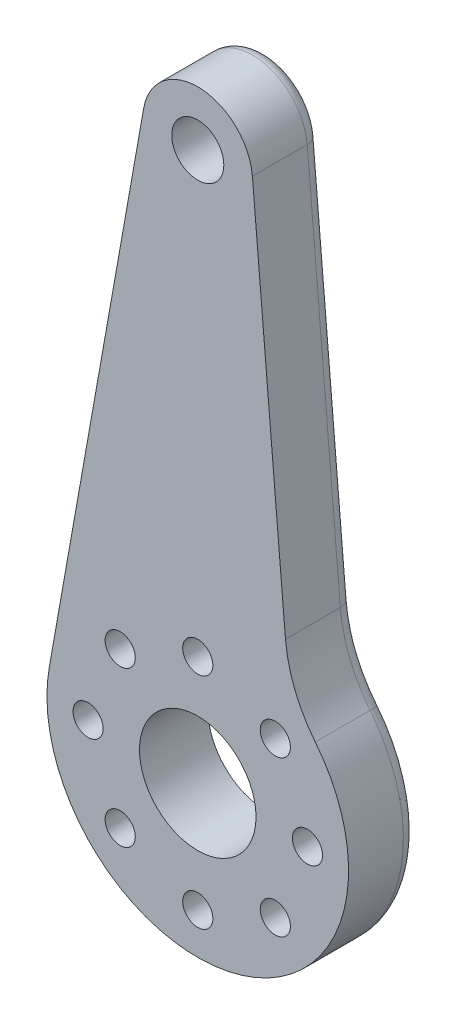
ISO-10303-21;
HEADER;
FILE_DESCRIPTION(('STEP AP214'),'2;1');
FILE_NAME('part.step','',(''),(''),'','','');
FILE_SCHEMA(('AUTOMOTIVE_DESIGN { 1 0 10303 214 1 1 1 1 }'));
ENDSEC;
DATA;
#1=APPLICATION_CONTEXT('core data for automotive mechanical design processes');
#2=APPLICATION_PROTOCOL_DEFINITION('international standard','automotive_design',2000,#1);
#3=PRODUCT_CONTEXT('',#1,'mechanical');
#4=PRODUCT('Part','Part','',(#3));
#5=PRODUCT_RELATED_PRODUCT_CATEGORY('part','',(#4));
#6=PRODUCT_DEFINITION_FORMATION('','',#4);
#7=PRODUCT_DEFINITION_CONTEXT('part definition',#1,'design');
#8=PRODUCT_DEFINITION('design','',#6,#7);
#9=PRODUCT_DEFINITION_SHAPE('','',#8);
#10=(LENGTH_UNIT() NAMED_UNIT(*) SI_UNIT(.MILLI.,.METRE.));
#11=(NAMED_UNIT(*) PLANE_ANGLE_UNIT() SI_UNIT($,.RADIAN.));
#12=(NAMED_UNIT(*) SI_UNIT($,.STERADIAN.) SOLID_ANGLE_UNIT());
#13=UNCERTAINTY_MEASURE_WITH_UNIT(LENGTH_MEASURE(1.E-05),#10,'distance_accuracy_value','');
#14=(GEOMETRIC_REPRESENTATION_CONTEXT(3) GLOBAL_UNCERTAINTY_ASSIGNED_CONTEXT((#13)) GLOBAL_UNIT_ASSIGNED_CONTEXT((#10,
#11,#12)) REPRESENTATION_CONTEXT('',''));
#15=CARTESIAN_POINT('',(0.,0.,0.));
#16=DIRECTION('',(0.,0.,1.));
#17=DIRECTION('',(1.,0.,0.));
#18=AXIS2_PLACEMENT_3D('',#15,#16,#17);
#19=CARTESIAN_POINT('',(-6.98836404370238,-20.3489036018759,5.));
#20=DIRECTION('',(0.,0.,-1.));
#21=DIRECTION('',(-1.,0.,0.));
#22=AXIS2_PLACEMENT_3D('',#19,#20,#21);
#23=CYLINDRICAL_SURFACE('',#22,1.1);
#24=CARTESIAN_POINT('',(-6.98836404370238,-20.3489036018759,5.));
#25=DIRECTION('',(0.,0.,1.));
#26=DIRECTION('',(1.,0.,0.));
#27=AXIS2_PLACEMENT_3D('',#24,#25,#26);
#28=CIRCLE('',#27,1.1);
#29=CARTESIAN_POINT('',(-5.88836404370238,-20.3489036018759,5.));
#30=VERTEX_POINT('',#29);
#31=EDGE_CURVE('E191',#30,#30,#28,.T.);
#32=ORIENTED_EDGE('',*,*,#31,.T.);
#33=EDGE_LOOP('',(#32));
#34=FACE_BOUND('',#33,.T.);
#35=CARTESIAN_POINT('',(-6.98836404370238,-20.3489036018759,2.25));
#36=DIRECTION('',(0.,0.,-1.));
#37=DIRECTION('',(-1.,0.,0.));
#38=AXIS2_PLACEMENT_3D('',#35,#36,#37);
#39=CIRCLE('',#38,1.1);
#40=CARTESIAN_POINT('',(-8.08836404370238,-20.3489036018759,2.25));
#41=VERTEX_POINT('',#40);
#42=EDGE_CURVE('E173',#41,#41,#39,.T.);
#43=ORIENTED_EDGE('',*,*,#42,.T.);
#44=EDGE_LOOP('',(#43));
#45=FACE_BOUND('',#44,.T.);
#46=ADVANCED_FACE('F36',(#34,#45),#23,.F.);
#47=CARTESIAN_POINT('',(-9.33150979421,-26.0057578513683,5.));
#48=DIRECTION('',(0.,0.,-1.));
#49=DIRECTION('',(-1.,0.,0.));
#50=AXIS2_PLACEMENT_3D('',#47,#48,#49);
#51=CYLINDRICAL_SURFACE('',#50,1.1);
#52=CARTESIAN_POINT('',(-9.33150979421,-26.0057578513683,5.));
#53=DIRECTION('',(0.,0.,1.));
#54=DIRECTION('',(1.,0.,0.));
#55=AXIS2_PLACEMENT_3D('',#52,#53,#54);
#56=CIRCLE('',#55,1.1);
#57=CARTESIAN_POINT('',(-8.23150979421,-26.0057578513683,5.));
#58=VERTEX_POINT('',#57);
#59=EDGE_CURVE('E188',#58,#58,#56,.T.);
#60=ORIENTED_EDGE('',*,*,#59,.T.);
#61=EDGE_LOOP('',(#60));
#62=FACE_BOUND('',#61,.T.);
#63=CARTESIAN_POINT('',(-9.33150979421,-26.0057578513683,2.25));
#64=DIRECTION('',(0.,0.,-1.));
#65=DIRECTION('',(-1.,0.,0.));
#66=AXIS2_PLACEMENT_3D('',#63,#64,#65);
#67=CIRCLE('',#66,1.1);
#68=CARTESIAN_POINT('',(-10.43150979421,-26.0057578513683,2.25));
#69=VERTEX_POINT('',#68);
#70=EDGE_CURVE('E230',#69,#69,#67,.T.);
#71=ORIENTED_EDGE('',*,*,#70,.T.);
#72=EDGE_LOOP('',(#71));
#73=FACE_BOUND('',#72,.T.);
#74=ADVANCED_FACE('F308',(#62,#73),#51,.F.);
#75=CARTESIAN_POINT('',(-14.9883640437024,-28.3489036018759,5.));
#76=DIRECTION('',(0.,0.,-1.));
#77=DIRECTION('',(-1.,0.,0.));
#78=AXIS2_PLACEMENT_3D('',#75,#76,#77);
#79=CYLINDRICAL_SURFACE('',#78,1.1);
#80=CARTESIAN_POINT('',(-14.9883640437024,-28.3489036018759,5.));
#81=DIRECTION('',(0.,0.,1.));
#82=DIRECTION('',(1.,0.,0.));
#83=AXIS2_PLACEMENT_3D('',#80,#81,#82);
#84=CIRCLE('',#83,1.1);
#85=CARTESIAN_POINT('',(-13.8883640437024,-28.3489036018759,5.));
#86=VERTEX_POINT('',#85);
#87=EDGE_CURVE('E185',#86,#86,#84,.T.);
#88=ORIENTED_EDGE('',*,*,#87,.T.);
#89=EDGE_LOOP('',(#88));
#90=FACE_BOUND('',#89,.T.);
#91=CARTESIAN_POINT('',(-14.9883640437024,-28.3489036018759,2.25));
#92=DIRECTION('',(0.,0.,-1.));
#93=DIRECTION('',(-1.,0.,0.));
#94=AXIS2_PLACEMENT_3D('',#91,#92,#93);
#95=CIRCLE('',#94,1.1);
#96=CARTESIAN_POINT('',(-16.0883640437024,-28.3489036018759,2.25));
#97=VERTEX_POINT('',#96);
#98=EDGE_CURVE('E227',#97,#97,#95,.T.);
#99=ORIENTED_EDGE('',*,*,#98,.T.);
#100=EDGE_LOOP('',(#99));
#101=FACE_BOUND('',#100,.T.);
#102=ADVANCED_FACE('F314',(#90,#101),#79,.F.);
#103=CARTESIAN_POINT('',(-20.6452182931948,-26.0057578513683,5.));
#104=DIRECTION('',(0.,0.,-1.));
#105=DIRECTION('',(-1.,0.,0.));
#106=AXIS2_PLACEMENT_3D('',#103,#104,#105);
#107=CYLINDRICAL_SURFACE('',#106,1.1);
#108=CARTESIAN_POINT('',(-20.6452182931948,-26.0057578513683,5.));
#109=DIRECTION('',(0.,0.,1.));
#110=DIRECTION('',(1.,0.,0.));
#111=AXIS2_PLACEMENT_3D('',#108,#109,#110);
#112=CIRCLE('',#111,1.1);
#113=CARTESIAN_POINT('',(-19.5452182931948,-26.0057578513683,5.));
#114=VERTEX_POINT('',#113);
#115=EDGE_CURVE('E182',#114,#114,#112,.T.);
#116=ORIENTED_EDGE('',*,*,#115,.T.);
#117=EDGE_LOOP('',(#116));
#118=FACE_BOUND('',#117,.T.);
#119=CARTESIAN_POINT('',(-20.6452182931948,-26.0057578513683,2.25));
#120=DIRECTION('',(0.,0.,-1.));
#121=DIRECTION('',(-1.,0.,0.));
#122=AXIS2_PLACEMENT_3D('',#119,#120,#121);
#123=CIRCLE('',#122,1.1);
#124=CARTESIAN_POINT('',(-21.7452182931948,-26.0057578513683,2.25));
#125=VERTEX_POINT('',#124);
#126=EDGE_CURVE('E224',#125,#125,#123,.T.);
#127=ORIENTED_EDGE('',*,*,#126,.T.);
#128=EDGE_LOOP('',(#127));
#129=FACE_BOUND('',#128,.T.);
#130=ADVANCED_FACE('F425',(#118,#129),#107,.F.);
#131=CARTESIAN_POINT('',(-22.9883640437024,-20.3489036018759,5.));
#132=DIRECTION('',(0.,0.,-1.));
#133=DIRECTION('',(-1.,0.,0.));
#134=AXIS2_PLACEMENT_3D('',#131,#132,#133);
#135=CYLINDRICAL_SURFACE('',#134,1.1);
#136=CARTESIAN_POINT('',(-22.9883640437024,-20.3489036018759,5.));
#137=DIRECTION('',(0.,0.,1.));
#138=DIRECTION('',(1.,0.,0.));
#139=AXIS2_PLACEMENT_3D('',#136,#137,#138);
#140=CIRCLE('',#139,1.1);
#141=CARTESIAN_POINT('',(-21.8883640437024,-20.3489036018759,5.));
#142=VERTEX_POINT('',#141);
#143=EDGE_CURVE('E179',#142,#142,#140,.T.);
#144=ORIENTED_EDGE('',*,*,#143,.T.);
#145=EDGE_LOOP('',(#144));
#146=FACE_BOUND('',#145,.T.);
#147=CARTESIAN_POINT('',(-22.9883640437024,-20.3489036018759,2.25));
#148=DIRECTION('',(0.,0.,-1.));
#149=DIRECTION('',(-1.,0.,0.));
#150=AXIS2_PLACEMENT_3D('',#147,#148,#149);
#151=CIRCLE('',#150,1.1);
#152=CARTESIAN_POINT('',(-24.0883640437024,-20.3489036018759,2.25));
#153=VERTEX_POINT('',#152);
#154=EDGE_CURVE('E221',#153,#153,#151,.T.);
#155=ORIENTED_EDGE('',*,*,#154,.T.);
#156=EDGE_LOOP('',(#155));
#157=FACE_BOUND('',#156,.T.);
#158=ADVANCED_FACE('F421',(#146,#157),#135,.F.);
#159=CARTESIAN_POINT('',(-20.6452182931948,-14.6920493523836,5.));
#160=DIRECTION('',(0.,0.,-1.));
#161=DIRECTION('',(-1.,0.,0.));
#162=AXIS2_PLACEMENT_3D('',#159,#160,#161);
#163=CYLINDRICAL_SURFACE('',#162,1.1);
#164=CARTESIAN_POINT('',(-20.6452182931948,-14.6920493523836,5.));
#165=DIRECTION('',(0.,0.,1.));
#166=DIRECTION('',(1.,0.,0.));
#167=AXIS2_PLACEMENT_3D('',#164,#165,#166);
#168=CIRCLE('',#167,1.1);
#169=CARTESIAN_POINT('',(-19.5452182931948,-14.6920493523836,5.));
#170=VERTEX_POINT('',#169);
#171=EDGE_CURVE('E176',#170,#170,#168,.T.);
#172=ORIENTED_EDGE('',*,*,#171,.T.);
#173=EDGE_LOOP('',(#172));
#174=FACE_BOUND('',#173,.T.);
#175=CARTESIAN_POINT('',(-20.6452182931948,-14.6920493523836,2.25));
#176=DIRECTION('',(0.,0.,-1.));
#177=DIRECTION('',(-1.,0.,0.));
#178=AXIS2_PLACEMENT_3D('',#175,#176,#177);
#179=CIRCLE('',#178,1.1);
#180=CARTESIAN_POINT('',(-21.7452182931948,-14.6920493523836,2.25));
#181=VERTEX_POINT('',#180);
#182=EDGE_CURVE('E218',#181,#181,#179,.T.);
#183=ORIENTED_EDGE('',*,*,#182,.T.);
#184=EDGE_LOOP('',(#183));
#185=FACE_BOUND('',#184,.T.);
#186=ADVANCED_FACE('F417',(#174,#185),#163,.F.);
#187=CARTESIAN_POINT('',(-14.9883640437024,-12.3489036018759,5.));
#188=DIRECTION('',(0.,0.,-1.));
#189=DIRECTION('',(-1.,0.,0.));
#190=AXIS2_PLACEMENT_3D('',#187,#188,#189);
#191=CYLINDRICAL_SURFACE('',#190,1.1);
#192=CARTESIAN_POINT('',(-14.9883640437024,-12.3489036018759,5.));
#193=DIRECTION('',(0.,0.,1.));
#194=DIRECTION('',(1.,0.,0.));
#195=AXIS2_PLACEMENT_3D('',#192,#193,#194);
#196=CIRCLE('',#195,1.1);
#197=CARTESIAN_POINT('',(-13.8883640437024,-12.3489036018759,5.));
#198=VERTEX_POINT('',#197);
#199=EDGE_CURVE('E172',#198,#198,#196,.T.);
#200=ORIENTED_EDGE('',*,*,#199,.T.);
#201=EDGE_LOOP('',(#200));
#202=FACE_BOUND('',#201,.T.);
#203=CARTESIAN_POINT('',(-14.9883640437024,-12.3489036018759,2.25));
#204=DIRECTION('',(0.,0.,-1.));
#205=DIRECTION('',(-1.,0.,0.));
#206=AXIS2_PLACEMENT_3D('',#203,#204,#205);
#207=CIRCLE('',#206,1.1);
#208=CARTESIAN_POINT('',(-16.0883640437024,-12.3489036018759,2.25));
#209=VERTEX_POINT('',#208);
#210=EDGE_CURVE('E215',#209,#209,#207,.T.);
#211=ORIENTED_EDGE('',*,*,#210,.T.);
#212=EDGE_LOOP('',(#211));
#213=FACE_BOUND('',#212,.T.);
#214=ADVANCED_FACE('F413',(#202,#213),#191,.F.);
#215=CARTESIAN_POINT('',(-9.33150979421,-14.6920493523836,5.));
#216=DIRECTION('',(0.,0.,-1.));
#217=DIRECTION('',(-1.,0.,0.));
#218=AXIS2_PLACEMENT_3D('',#215,#216,#217);
#219=CYLINDRICAL_SURFACE('',#218,1.1);
#220=CARTESIAN_POINT('',(-9.33150979421,-14.6920493523836,5.));
#221=DIRECTION('',(0.,0.,1.));
#222=DIRECTION('',(1.,0.,0.));
#223=AXIS2_PLACEMENT_3D('',#220,#221,#222);
#224=CIRCLE('',#223,1.1);
#225=CARTESIAN_POINT('',(-8.23150979421,-14.6920493523836,5.));
#226=VERTEX_POINT('',#225);
#227=EDGE_CURVE('E169',#226,#226,#224,.T.);
#228=ORIENTED_EDGE('',*,*,#227,.T.);
#229=EDGE_LOOP('',(#228));
#230=FACE_BOUND('',#229,.T.);
#231=CARTESIAN_POINT('',(-9.33150979421,-14.6920493523836,2.25));
#232=DIRECTION('',(0.,0.,-1.));
#233=DIRECTION('',(-1.,0.,0.));
#234=AXIS2_PLACEMENT_3D('',#231,#232,#233);
#235=CIRCLE('',#234,1.1);
#236=CARTESIAN_POINT('',(-10.43150979421,-14.6920493523836,2.25));
#237=VERTEX_POINT('',#236);
#238=EDGE_CURVE('E166',#237,#237,#235,.T.);
#239=ORIENTED_EDGE('',*,*,#238,.T.);
#240=EDGE_LOOP('',(#239));
#241=FACE_BOUND('',#240,.T.);
#242=ADVANCED_FACE('F331',(#230,#241),#219,.F.);
#243=CARTESIAN_POINT('',(-14.9883640437024,19.6510963981241,5.));
#244=DIRECTION('',(0.,0.,1.));
#245=DIRECTION('',(1.,0.,0.));
#246=AXIS2_PLACEMENT_3D('',#243,#244,#245);
#247=PLANE('',#246);
#248=DIRECTION('',(0.0857880421638127,-0.996313410439557,0.));
#249=VECTOR('',#248,1.);
#250=CARTESIAN_POINT('',(-11.0031104019442,19.9942485667793,5.));
#251=LINE('',#250,#249);
#252=CARTESIAN_POINT('',(-11.0031104019442,19.9942485667793,5.));
#253=VERTEX_POINT('',#252);
#254=CARTESIAN_POINT('',(-8.58888305649522,-8.04377420949149,5.));
#255=VERTEX_POINT('',#254);
#256=EDGE_CURVE('E110',#253,#255,#251,.T.);
#257=ORIENTED_EDGE('',*,*,#256,.F.);
#258=CARTESIAN_POINT('',(-14.9883640437024,19.6510963981241,5.));
#259=DIRECTION('',(0.,0.,1.));
#260=DIRECTION('',(1.,0.,0.));
#261=AXIS2_PLACEMENT_3D('',#258,#259,#260);
#262=CIRCLE('',#261,4.);
#263=CARTESIAN_POINT('',(-18.9266377772054,20.3510963981241,5.));
#264=VERTEX_POINT('',#263);
#265=EDGE_CURVE('E99',#253,#264,#262,.T.);
#266=ORIENTED_EDGE('',*,*,#265,.T.);
#267=DIRECTION('',(-0.175,-0.984568433375761,0.));
#268=VECTOR('',#267,1.);
#269=CARTESIAN_POINT('',(-18.9266377772054,20.3510963981241,5.));
#270=LINE('',#269,#268);
#271=CARTESIAN_POINT('',(-25.8186168108358,-18.4239036018759,5.));
#272=VERTEX_POINT('',#271);
#273=EDGE_CURVE('E105',#264,#272,#270,.T.);
#274=ORIENTED_EDGE('',*,*,#273,.T.);
#275=CARTESIAN_POINT('',(-14.9883640437024,-20.3489036018759,5.));
#276=DIRECTION('',(0.,0.,1.));
#277=DIRECTION('',(1.,0.,0.));
#278=AXIS2_PLACEMENT_3D('',#275,#276,#277);
#279=CIRCLE('',#278,11.);
#280=CARTESIAN_POINT('',(-6.41747042429143,-13.4539936992927,5.));
#281=VERTEX_POINT('',#280);
#282=EDGE_CURVE('E206',#272,#281,#279,.T.);
#283=ORIENTED_EDGE('',*,*,#282,.T.);
#284=CARTESIAN_POINT('',(1.37425104790034,-7.18589378785335,5.));
#285=DIRECTION('',(0.,0.,1.));
#286=DIRECTION('',(1.,0.,0.));
#287=AXIS2_PLACEMENT_3D('',#284,#285,#286);
#288=CIRCLE('',#287,10.);
#289=EDGE_CURVE('E117',#281,#255,#288,.F.);
#290=ORIENTED_EDGE('',*,*,#289,.T.);
#291=EDGE_LOOP('',(#257,#266,#274,#283,#290));
#292=FACE_BOUND('',#291,.T.);
#293=ORIENTED_EDGE('',*,*,#199,.F.);
#294=EDGE_LOOP('',(#293));
#295=FACE_BOUND('',#294,.T.);
#296=ORIENTED_EDGE('',*,*,#143,.F.);
#297=EDGE_LOOP('',(#296));
#298=FACE_BOUND('',#297,.T.);
#299=ORIENTED_EDGE('',*,*,#87,.F.);
#300=EDGE_LOOP('',(#299));
#301=FACE_BOUND('',#300,.T.);
#302=ORIENTED_EDGE('',*,*,#31,.F.);
#303=EDGE_LOOP('',(#302));
#304=FACE_BOUND('',#303,.T.);
#305=CARTESIAN_POINT('',(-14.9883640437024,19.6510963981241,5.));
#306=DIRECTION('',(0.,0.,1.));
#307=DIRECTION('',(1.,0.,0.));
#308=AXIS2_PLACEMENT_3D('',#305,#306,#307);
#309=CIRCLE('',#308,1.9);
#310=CARTESIAN_POINT('',(-13.0883640437024,19.6510963981241,5.));
#311=VERTEX_POINT('',#310);
#312=EDGE_CURVE('E106',#311,#311,#309,.T.);
#313=ORIENTED_EDGE('',*,*,#312,.F.);
#314=EDGE_LOOP('',(#313));
#315=FACE_BOUND('',#314,.T.);
#316=CARTESIAN_POINT('',(-14.9883640437024,-20.3489036018759,5.));
#317=DIRECTION('',(0.,0.,1.));
#318=DIRECTION('',(1.,0.,0.));
#319=AXIS2_PLACEMENT_3D('',#316,#317,#318);
#320=CIRCLE('',#319,4.25);
#321=CARTESIAN_POINT('',(-10.7383640437024,-20.3489036018759,5.));
#322=VERTEX_POINT('',#321);
#323=EDGE_CURVE('E195',#322,#322,#320,.T.);
#324=ORIENTED_EDGE('',*,*,#323,.F.);
#325=EDGE_LOOP('',(#324));
#326=FACE_BOUND('',#325,.T.);
#327=ORIENTED_EDGE('',*,*,#59,.F.);
#328=EDGE_LOOP('',(#327));
#329=FACE_BOUND('',#328,.T.);
#330=ORIENTED_EDGE('',*,*,#115,.F.);
#331=EDGE_LOOP('',(#330));
#332=FACE_BOUND('',#331,.T.);
#333=ORIENTED_EDGE('',*,*,#171,.F.);
#334=EDGE_LOOP('',(#333));
#335=FACE_BOUND('',#334,.T.);
#336=ORIENTED_EDGE('',*,*,#227,.F.);
#337=EDGE_LOOP('',(#336));
#338=FACE_BOUND('',#337,.T.);
#339=ADVANCED_FACE('F113',(#292,#295,#298,#301,#304,#315,#326,#329,#332,#335,#338),#247,.T.);
#340=CARTESIAN_POINT('',(-14.9883640437024,19.6510963981241,0.));
#341=DIRECTION('',(0.,0.,1.));
#342=DIRECTION('',(1.,0.,0.));
#343=AXIS2_PLACEMENT_3D('',#340,#341,#342);
#344=PLANE('',#343);
#345=CARTESIAN_POINT('',(1.37425104790034,-7.18589378785335,0.));
#346=DIRECTION('',(0.,0.,1.));
#347=DIRECTION('',(1.,0.,0.));
#348=AXIS2_PLACEMENT_3D('',#345,#346,#347);
#349=CIRCLE('',#348,11.);
#350=CARTESIAN_POINT('',(-9.58519646693478,-8.12956225165529,0.));
#351=VERTEX_POINT('',#350);
#352=CARTESIAN_POINT('',(-7.1966425715106,-14.0808036904366,0.));
#353=VERTEX_POINT('',#352);
#354=EDGE_CURVE('E248',#351,#353,#349,.T.);
#355=ORIENTED_EDGE('',*,*,#354,.T.);
#356=CARTESIAN_POINT('',(-14.9883640437024,-20.3489036018759,0.));
#357=DIRECTION('',(0.,0.,1.));
#358=DIRECTION('',(1.,0.,0.));
#359=AXIS2_PLACEMENT_3D('',#356,#357,#358);
#360=CIRCLE('',#359,10.);
#361=CARTESIAN_POINT('',(-24.83404837746,-18.5989036018759,0.));
#362=VERTEX_POINT('',#361);
#363=EDGE_CURVE('E250',#353,#362,#360,.F.);
#364=ORIENTED_EDGE('',*,*,#363,.T.);
#365=DIRECTION('',(-0.175,-0.984568433375761,0.));
#366=VECTOR('',#365,1.);
#367=CARTESIAN_POINT('',(-17.9420693438297,20.1760963981241,0.));
#368=LINE('',#367,#366);
#369=CARTESIAN_POINT('',(-17.9420693438297,20.1760963981241,0.));
#370=VERTEX_POINT('',#369);
#371=EDGE_CURVE('E242',#362,#370,#368,.F.);
#372=ORIENTED_EDGE('',*,*,#371,.T.);
#373=CARTESIAN_POINT('',(-14.9883640437024,19.6510963981241,0.));
#374=DIRECTION('',(0.,0.,1.));
#375=DIRECTION('',(1.,0.,0.));
#376=AXIS2_PLACEMENT_3D('',#373,#374,#375);
#377=CIRCLE('',#376,3.);
#378=CARTESIAN_POINT('',(-11.9994238123837,19.9084605246155,0.));
#379=VERTEX_POINT('',#378);
#380=EDGE_CURVE('E244',#370,#379,#377,.F.);
#381=ORIENTED_EDGE('',*,*,#380,.T.);
#382=DIRECTION('',(-0.0857880421638127,0.996313410439557,0.));
#383=VECTOR('',#382,1.);
#384=CARTESIAN_POINT('',(-11.9994238123837,19.9084605246155,0.));
#385=LINE('',#384,#383);
#386=EDGE_CURVE('E246',#379,#351,#385,.F.);
#387=ORIENTED_EDGE('',*,*,#386,.T.);
#388=EDGE_LOOP('',(#355,#364,#372,#381,#387));
#389=FACE_BOUND('',#388,.T.);
#390=CARTESIAN_POINT('',(-20.6452182931948,-14.6920493523836,0.));
#391=DIRECTION('',(0.,0.,-1.));
#392=DIRECTION('',(-1.,0.,0.));
#393=AXIS2_PLACEMENT_3D('',#390,#391,#392);
#394=CIRCLE('',#393,1.75);
#395=CARTESIAN_POINT('',(-22.3952182931948,-14.6920493523836,0.));
#396=VERTEX_POINT('',#395);
#397=EDGE_CURVE('E118',#396,#396,#394,.T.);
#398=ORIENTED_EDGE('',*,*,#397,.F.);
#399=EDGE_LOOP('',(#398));
#400=FACE_BOUND('',#399,.T.);
#401=CARTESIAN_POINT('',(-14.9883640437024,-12.3489036018759,0.));
#402=DIRECTION('',(0.,0.,-1.));
#403=DIRECTION('',(-1.,0.,0.));
#404=AXIS2_PLACEMENT_3D('',#401,#402,#403);
#405=CIRCLE('',#404,1.75);
#406=CARTESIAN_POINT('',(-16.7383640437024,-12.3489036018759,0.));
#407=VERTEX_POINT('',#406);
#408=EDGE_CURVE('E158',#407,#407,#405,.T.);
#409=ORIENTED_EDGE('',*,*,#408,.F.);
#410=EDGE_LOOP('',(#409));
#411=FACE_BOUND('',#410,.T.);
#412=CARTESIAN_POINT('',(-9.33150979421,-14.6920493523836,0.));
#413=DIRECTION('',(0.,0.,-1.));
#414=DIRECTION('',(-1.,0.,0.));
#415=AXIS2_PLACEMENT_3D('',#412,#413,#414);
#416=CIRCLE('',#415,1.75);
#417=CARTESIAN_POINT('',(-11.08150979421,-14.6920493523836,0.));
#418=VERTEX_POINT('',#417);
#419=EDGE_CURVE('E152',#418,#418,#416,.T.);
#420=ORIENTED_EDGE('',*,*,#419,.F.);
#421=EDGE_LOOP('',(#420));
#422=FACE_BOUND('',#421,.T.);
#423=CARTESIAN_POINT('',(-6.98836404370238,-20.3489036018759,0.));
#424=DIRECTION('',(0.,0.,-1.));
#425=DIRECTION('',(-1.,0.,0.));
#426=AXIS2_PLACEMENT_3D('',#423,#424,#425);
#427=CIRCLE('',#426,1.75);
#428=CARTESIAN_POINT('',(-8.73836404370238,-20.3489036018759,0.));
#429=VERTEX_POINT('',#428);
#430=EDGE_CURVE('E146',#429,#429,#427,.T.);
#431=ORIENTED_EDGE('',*,*,#430,.F.);
#432=EDGE_LOOP('',(#431));
#433=FACE_BOUND('',#432,.T.);
#434=CARTESIAN_POINT('',(-9.33150979421,-26.0057578513683,0.));
#435=DIRECTION('',(0.,0.,-1.));
#436=DIRECTION('',(-1.,0.,0.));
#437=AXIS2_PLACEMENT_3D('',#434,#435,#436);
#438=CIRCLE('',#437,1.75);
#439=CARTESIAN_POINT('',(-11.08150979421,-26.0057578513683,0.));
#440=VERTEX_POINT('',#439);
#441=EDGE_CURVE('E140',#440,#440,#438,.T.);
#442=ORIENTED_EDGE('',*,*,#441,.F.);
#443=EDGE_LOOP('',(#442));
#444=FACE_BOUND('',#443,.T.);
#445=CARTESIAN_POINT('',(-14.9883640437024,-28.3489036018759,0.));
#446=DIRECTION('',(0.,0.,-1.));
#447=DIRECTION('',(-1.,0.,0.));
#448=AXIS2_PLACEMENT_3D('',#445,#446,#447);
#449=CIRCLE('',#448,1.75);
#450=CARTESIAN_POINT('',(-16.7383640437024,-28.3489036018759,0.));
#451=VERTEX_POINT('',#450);
#452=EDGE_CURVE('E134',#451,#451,#449,.T.);
#453=ORIENTED_EDGE('',*,*,#452,.F.);
#454=EDGE_LOOP('',(#453));
#455=FACE_BOUND('',#454,.T.);
#456=CARTESIAN_POINT('',(-20.6452182931948,-26.0057578513683,0.));
#457=DIRECTION('',(0.,0.,-1.));
#458=DIRECTION('',(-1.,0.,0.));
#459=AXIS2_PLACEMENT_3D('',#456,#457,#458);
#460=CIRCLE('',#459,1.74999999999999);
#461=CARTESIAN_POINT('',(-22.3952182931948,-26.0057578513683,0.));
#462=VERTEX_POINT('',#461);
#463=EDGE_CURVE('E128',#462,#462,#460,.T.);
#464=ORIENTED_EDGE('',*,*,#463,.F.);
#465=EDGE_LOOP('',(#464));
#466=FACE_BOUND('',#465,.T.);
#467=CARTESIAN_POINT('',(-22.9883640437024,-20.3489036018759,0.));
#468=DIRECTION('',(0.,0.,-1.));
#469=DIRECTION('',(-1.,0.,0.));
#470=AXIS2_PLACEMENT_3D('',#467,#468,#469);
#471=CIRCLE('',#470,1.75);
#472=CARTESIAN_POINT('',(-24.7383640437024,-20.3489036018759,0.));
#473=VERTEX_POINT('',#472);
#474=EDGE_CURVE('E127',#473,#473,#471,.T.);
#475=ORIENTED_EDGE('',*,*,#474,.F.);
#476=EDGE_LOOP('',(#475));
#477=FACE_BOUND('',#476,.T.);
#478=CARTESIAN_POINT('',(-14.9883640437024,19.6510963981241,0.));
#479=DIRECTION('',(0.,0.,1.));
#480=DIRECTION('',(1.,0.,0.));
#481=AXIS2_PLACEMENT_3D('',#478,#479,#480);
#482=CIRCLE('',#481,1.9);
#483=CARTESIAN_POINT('',(-13.0883640437024,19.6510963981241,0.));
#484=VERTEX_POINT('',#483);
#485=EDGE_CURVE('E198',#484,#484,#482,.T.);
#486=ORIENTED_EDGE('',*,*,#485,.T.);
#487=EDGE_LOOP('',(#486));
#488=FACE_BOUND('',#487,.T.);
#489=CARTESIAN_POINT('',(-14.9883640437024,-20.3489036018759,0.));
#490=DIRECTION('',(0.,0.,1.));
#491=DIRECTION('',(1.,0.,0.));
#492=AXIS2_PLACEMENT_3D('',#489,#490,#491);
#493=CIRCLE('',#492,4.25);
#494=CARTESIAN_POINT('',(-10.7383640437024,-20.3489036018759,0.));
#495=VERTEX_POINT('',#494);
#496=EDGE_CURVE('E194',#495,#495,#493,.T.);
#497=ORIENTED_EDGE('',*,*,#496,.T.);
#498=EDGE_LOOP('',(#497));
#499=FACE_BOUND('',#498,.T.);
#500=ADVANCED_FACE('F296',(#389,#400,#411,#422,#433,#444,#455,#466,#477,#488,#499),#344,.F.);
#501=CARTESIAN_POINT('',(-14.9883640437024,19.6510963981241,5.));
#502=DIRECTION('',(0.,0.,-1.));
#503=DIRECTION('',(-1.,0.,0.));
#504=AXIS2_PLACEMENT_3D('',#501,#502,#503);
#505=CYLINDRICAL_SURFACE('',#504,4.);
#506=DIRECTION('',(0.,0.,-1.));
#507=VECTOR('',#506,1.);
#508=CARTESIAN_POINT('',(-11.0031104019442,19.9942485667793,10.));
#509=LINE('',#508,#507);
#510=CARTESIAN_POINT('',(-11.0031104019442,19.9942485667793,0.999999999999999));
#511=VERTEX_POINT('',#510);
#512=EDGE_CURVE('E101',#253,#511,#509,.T.);
#513=ORIENTED_EDGE('',*,*,#512,.T.);
#514=CARTESIAN_POINT('',(-14.9883640437024,19.6510963981241,1.));
#515=DIRECTION('',(0.,0.,1.));
#516=DIRECTION('',(1.,0.,0.));
#517=AXIS2_PLACEMENT_3D('',#514,#515,#516);
#518=CIRCLE('',#517,4.);
#519=CARTESIAN_POINT('',(-18.9266377772054,20.3510963981241,1.));
#520=VERTEX_POINT('',#519);
#521=EDGE_CURVE('E45',#511,#520,#518,.T.);
#522=ORIENTED_EDGE('',*,*,#521,.T.);
#523=DIRECTION('',(0.,0.,-1.));
#524=VECTOR('',#523,1.);
#525=CARTESIAN_POINT('',(-18.9266377772054,20.3510963981241,5.));
#526=LINE('',#525,#524);
#527=EDGE_CURVE('E102',#264,#520,#526,.T.);
#528=ORIENTED_EDGE('',*,*,#527,.F.);
#529=ORIENTED_EDGE('',*,*,#265,.F.);
#530=EDGE_LOOP('',(#513,#522,#528,#529));
#531=FACE_BOUND('',#530,.T.);
#532=ADVANCED_FACE('F100',(#531),#505,.T.);
#533=CARTESIAN_POINT('',(-18.9266377772054,20.3510963981241,5.));
#534=DIRECTION('',(0.984568433375761,-0.175,0.));
#535=DIRECTION('',(0.175,0.984568433375761,0.));
#536=AXIS2_PLACEMENT_3D('',#533,#534,#535);
#537=PLANE('',#536);
#538=ORIENTED_EDGE('',*,*,#527,.T.);
#539=DIRECTION('',(-0.175,-0.984568433375761,0.));
#540=VECTOR('',#539,1.);
#541=CARTESIAN_POINT('',(-18.9266377772054,20.3510963981241,1.));
#542=LINE('',#541,#540);
#543=CARTESIAN_POINT('',(-25.8186168108358,-18.4239036018759,1.));
#544=VERTEX_POINT('',#543);
#545=EDGE_CURVE('E11',#520,#544,#542,.T.);
#546=ORIENTED_EDGE('',*,*,#545,.T.);
#547=DIRECTION('',(0.,0.,-1.));
#548=VECTOR('',#547,1.);
#549=CARTESIAN_POINT('',(-25.8186168108358,-18.4239036018759,5.));
#550=LINE('',#549,#548);
#551=EDGE_CURVE('E208',#272,#544,#550,.T.);
#552=ORIENTED_EDGE('',*,*,#551,.F.);
#553=ORIENTED_EDGE('',*,*,#273,.F.);
#554=EDGE_LOOP('',(#538,#546,#552,#553));
#555=FACE_BOUND('',#554,.T.);
#556=ADVANCED_FACE('F282',(#555),#537,.F.);
#557=CARTESIAN_POINT('',(-14.9883640437024,-20.3489036018759,5.));
#558=DIRECTION('',(0.,0.,-1.));
#559=DIRECTION('',(-1.,0.,0.));
#560=AXIS2_PLACEMENT_3D('',#557,#558,#559);
#561=CYLINDRICAL_SURFACE('',#560,11.);
#562=ORIENTED_EDGE('',*,*,#551,.T.);
#563=CARTESIAN_POINT('',(-14.9883640437024,-20.3489036018759,1.));
#564=DIRECTION('',(0.,0.,1.));
#565=DIRECTION('',(1.,0.,0.));
#566=AXIS2_PLACEMENT_3D('',#563,#564,#565);
#567=CIRCLE('',#566,11.);
#568=CARTESIAN_POINT('',(-6.41747042429143,-13.4539936992927,1.));
#569=VERTEX_POINT('',#568);
#570=EDGE_CURVE('E239',#544,#569,#567,.T.);
#571=ORIENTED_EDGE('',*,*,#570,.T.);
#572=DIRECTION('',(0.,0.,-1.));
#573=VECTOR('',#572,1.);
#574=CARTESIAN_POINT('',(-6.41747042429143,-13.4539936992927,5.));
#575=LINE('',#574,#573);
#576=EDGE_CURVE('E236',#569,#281,#575,.F.);
#577=ORIENTED_EDGE('',*,*,#576,.T.);
#578=ORIENTED_EDGE('',*,*,#282,.F.);
#579=EDGE_LOOP('',(#562,#571,#577,#578));
#580=FACE_BOUND('',#579,.T.);
#581=ADVANCED_FACE('F285',(#580),#561,.T.);
#582=CARTESIAN_POINT('',(-14.9883640437024,19.6510963981241,5.));
#583=DIRECTION('',(0.,0.,-1.));
#584=DIRECTION('',(-1.,0.,0.));
#585=AXIS2_PLACEMENT_3D('',#582,#583,#584);
#586=CYLINDRICAL_SURFACE('',#585,1.9);
#587=ORIENTED_EDGE('',*,*,#312,.T.);
#588=EDGE_LOOP('',(#587));
#589=FACE_BOUND('',#588,.T.);
#590=ORIENTED_EDGE('',*,*,#485,.F.);
#591=EDGE_LOOP('',(#590));
#592=FACE_BOUND('',#591,.T.);
#593=ADVANCED_FACE('F324',(#589,#592),#586,.F.);
#594=CARTESIAN_POINT('',(-14.9883640437024,-20.3489036018759,5.));
#595=DIRECTION('',(0.,0.,-1.));
#596=DIRECTION('',(-1.,0.,0.));
#597=AXIS2_PLACEMENT_3D('',#594,#595,#596);
#598=CYLINDRICAL_SURFACE('',#597,4.25);
#599=ORIENTED_EDGE('',*,*,#323,.T.);
#600=EDGE_LOOP('',(#599));
#601=FACE_BOUND('',#600,.T.);
#602=ORIENTED_EDGE('',*,*,#496,.F.);
#603=EDGE_LOOP('',(#602));
#604=FACE_BOUND('',#603,.T.);
#605=ADVANCED_FACE('F320',(#601,#604),#598,.F.);
#606=CARTESIAN_POINT('',(-9.33150979421,-14.6920493523836,2.25));
#607=DIRECTION('',(0.,0.,-1.));
#608=DIRECTION('',(-1.,0.,0.));
#609=AXIS2_PLACEMENT_3D('',#606,#607,#608);
#610=CYLINDRICAL_SURFACE('',#609,1.75);
#611=CARTESIAN_POINT('',(-9.33150979421,-14.6920493523836,2.25));
#612=DIRECTION('',(0.,0.,-1.));
#613=DIRECTION('',(-1.,0.,0.));
#614=AXIS2_PLACEMENT_3D('',#611,#612,#613);
#615=CIRCLE('',#614,1.75);
#616=CARTESIAN_POINT('',(-11.08150979421,-14.6920493523836,2.25));
#617=VERTEX_POINT('',#616);
#618=EDGE_CURVE('E149',#617,#617,#615,.T.);
#619=ORIENTED_EDGE('',*,*,#618,.F.);
#620=EDGE_LOOP('',(#619));
#621=FACE_BOUND('',#620,.T.);
#622=ORIENTED_EDGE('',*,*,#419,.T.);
#623=EDGE_LOOP('',(#622));
#624=FACE_BOUND('',#623,.T.);
#625=ADVANCED_FACE('F323',(#621,#624),#610,.F.);
#626=CARTESIAN_POINT('',(-9.33150979421,-14.6920493523836,2.25));
#627=DIRECTION('',(0.,0.,-1.));
#628=DIRECTION('',(-1.,0.,0.));
#629=AXIS2_PLACEMENT_3D('',#626,#627,#628);
#630=PLANE('',#629);
#631=ORIENTED_EDGE('',*,*,#238,.F.);
#632=EDGE_LOOP('',(#631));
#633=FACE_BOUND('',#632,.T.);
#634=ORIENTED_EDGE('',*,*,#618,.T.);
#635=EDGE_LOOP('',(#634));
#636=FACE_BOUND('',#635,.T.);
#637=ADVANCED_FACE('F381',(#633,#636),#630,.T.);
#638=CARTESIAN_POINT('',(-14.9883640437024,-12.3489036018759,2.25));
#639=DIRECTION('',(0.,0.,-1.));
#640=DIRECTION('',(-1.,0.,0.));
#641=AXIS2_PLACEMENT_3D('',#638,#639,#640);
#642=CYLINDRICAL_SURFACE('',#641,1.75);
#643=CARTESIAN_POINT('',(-14.9883640437024,-12.3489036018759,2.25));
#644=DIRECTION('',(0.,0.,-1.));
#645=DIRECTION('',(-1.,0.,0.));
#646=AXIS2_PLACEMENT_3D('',#643,#644,#645);
#647=CIRCLE('',#646,1.75);
#648=CARTESIAN_POINT('',(-16.7383640437024,-12.3489036018759,2.25));
#649=VERTEX_POINT('',#648);
#650=EDGE_CURVE('E155',#649,#649,#647,.T.);
#651=ORIENTED_EDGE('',*,*,#650,.F.);
#652=EDGE_LOOP('',(#651));
#653=FACE_BOUND('',#652,.T.);
#654=ORIENTED_EDGE('',*,*,#408,.T.);
#655=EDGE_LOOP('',(#654));
#656=FACE_BOUND('',#655,.T.);
#657=ADVANCED_FACE('F384',(#653,#656),#642,.F.);
#658=CARTESIAN_POINT('',(-14.9883640437024,-12.3489036018759,2.25));
#659=DIRECTION('',(0.,0.,-1.));
#660=DIRECTION('',(-1.,0.,0.));
#661=AXIS2_PLACEMENT_3D('',#658,#659,#660);
#662=PLANE('',#661);
#663=ORIENTED_EDGE('',*,*,#210,.F.);
#664=EDGE_LOOP('',(#663));
#665=FACE_BOUND('',#664,.T.);
#666=ORIENTED_EDGE('',*,*,#650,.T.);
#667=EDGE_LOOP('',(#666));
#668=FACE_BOUND('',#667,.T.);
#669=ADVANCED_FACE('F389',(#665,#668),#662,.T.);
#670=CARTESIAN_POINT('',(-20.6452182931948,-14.6920493523836,2.25));
#671=DIRECTION('',(0.,0.,-1.));
#672=DIRECTION('',(-1.,0.,0.));
#673=AXIS2_PLACEMENT_3D('',#670,#671,#672);
#674=CYLINDRICAL_SURFACE('',#673,1.75);
#675=CARTESIAN_POINT('',(-20.6452182931948,-14.6920493523836,2.25));
#676=DIRECTION('',(0.,0.,-1.));
#677=DIRECTION('',(-1.,0.,0.));
#678=AXIS2_PLACEMENT_3D('',#675,#676,#677);
#679=CIRCLE('',#678,1.75);
#680=CARTESIAN_POINT('',(-22.3952182931948,-14.6920493523836,2.25));
#681=VERTEX_POINT('',#680);
#682=EDGE_CURVE('E121',#681,#681,#679,.T.);
#683=ORIENTED_EDGE('',*,*,#682,.F.);
#684=EDGE_LOOP('',(#683));
#685=FACE_BOUND('',#684,.T.);
#686=ORIENTED_EDGE('',*,*,#397,.T.);
#687=EDGE_LOOP('',(#686));
#688=FACE_BOUND('',#687,.T.);
#689=ADVANCED_FACE('F392',(#685,#688),#674,.F.);
#690=CARTESIAN_POINT('',(-20.6452182931948,-14.6920493523836,2.25));
#691=DIRECTION('',(0.,0.,-1.));
#692=DIRECTION('',(-1.,0.,0.));
#693=AXIS2_PLACEMENT_3D('',#690,#691,#692);
#694=PLANE('',#693);
#695=ORIENTED_EDGE('',*,*,#182,.F.);
#696=EDGE_LOOP('',(#695));
#697=FACE_BOUND('',#696,.T.);
#698=ORIENTED_EDGE('',*,*,#682,.T.);
#699=EDGE_LOOP('',(#698));
#700=FACE_BOUND('',#699,.T.);
#701=ADVANCED_FACE('F397',(#697,#700),#694,.T.);
#702=CARTESIAN_POINT('',(-22.9883640437024,-20.3489036018759,2.25));
#703=DIRECTION('',(0.,0.,-1.));
#704=DIRECTION('',(-1.,0.,0.));
#705=AXIS2_PLACEMENT_3D('',#702,#703,#704);
#706=CYLINDRICAL_SURFACE('',#705,1.75);
#707=CARTESIAN_POINT('',(-22.9883640437024,-20.3489036018759,2.25));
#708=DIRECTION('',(0.,0.,-1.));
#709=DIRECTION('',(-1.,0.,0.));
#710=AXIS2_PLACEMENT_3D('',#707,#708,#709);
#711=CIRCLE('',#710,1.75);
#712=CARTESIAN_POINT('',(-24.7383640437024,-20.3489036018759,2.25));
#713=VERTEX_POINT('',#712);
#714=EDGE_CURVE('E163',#713,#713,#711,.T.);
#715=ORIENTED_EDGE('',*,*,#714,.F.);
#716=EDGE_LOOP('',(#715));
#717=FACE_BOUND('',#716,.T.);
#718=ORIENTED_EDGE('',*,*,#474,.T.);
#719=EDGE_LOOP('',(#718));
#720=FACE_BOUND('',#719,.T.);
#721=ADVANCED_FACE('F400',(#717,#720),#706,.F.);
#722=CARTESIAN_POINT('',(-22.9883640437024,-20.3489036018759,2.25));
#723=DIRECTION('',(0.,0.,-1.));
#724=DIRECTION('',(-1.,0.,0.));
#725=AXIS2_PLACEMENT_3D('',#722,#723,#724);
#726=PLANE('',#725);
#727=ORIENTED_EDGE('',*,*,#154,.F.);
#728=EDGE_LOOP('',(#727));
#729=FACE_BOUND('',#728,.T.);
#730=ORIENTED_EDGE('',*,*,#714,.T.);
#731=EDGE_LOOP('',(#730));
#732=FACE_BOUND('',#731,.T.);
#733=ADVANCED_FACE('F361',(#729,#732),#726,.T.);
#734=CARTESIAN_POINT('',(-20.6452182931948,-26.0057578513683,2.25));
#735=DIRECTION('',(0.,0.,-1.));
#736=DIRECTION('',(-1.,0.,0.));
#737=AXIS2_PLACEMENT_3D('',#734,#735,#736);
#738=CYLINDRICAL_SURFACE('',#737,1.74999999999999);
#739=CARTESIAN_POINT('',(-20.6452182931948,-26.0057578513683,2.25));
#740=DIRECTION('',(0.,0.,-1.));
#741=DIRECTION('',(-1.,0.,0.));
#742=AXIS2_PLACEMENT_3D('',#739,#740,#741);
#743=CIRCLE('',#742,1.74999999999999);
#744=CARTESIAN_POINT('',(-22.3952182931948,-26.0057578513683,2.25));
#745=VERTEX_POINT('',#744);
#746=EDGE_CURVE('E124',#745,#745,#743,.T.);
#747=ORIENTED_EDGE('',*,*,#746,.F.);
#748=EDGE_LOOP('',(#747));
#749=FACE_BOUND('',#748,.T.);
#750=ORIENTED_EDGE('',*,*,#463,.T.);
#751=EDGE_LOOP('',(#750));
#752=FACE_BOUND('',#751,.T.);
#753=ADVANCED_FACE('F357',(#749,#752),#738,.F.);
#754=CARTESIAN_POINT('',(-20.6452182931948,-26.0057578513683,2.25));
#755=DIRECTION('',(0.,0.,-1.));
#756=DIRECTION('',(-1.,0.,0.));
#757=AXIS2_PLACEMENT_3D('',#754,#755,#756);
#758=PLANE('',#757);
#759=ORIENTED_EDGE('',*,*,#126,.F.);
#760=EDGE_LOOP('',(#759));
#761=FACE_BOUND('',#760,.T.);
#762=ORIENTED_EDGE('',*,*,#746,.T.);
#763=EDGE_LOOP('',(#762));
#764=FACE_BOUND('',#763,.T.);
#765=ADVANCED_FACE('F353',(#761,#764),#758,.T.);
#766=CARTESIAN_POINT('',(-14.9883640437024,-28.3489036018759,2.25));
#767=DIRECTION('',(0.,0.,-1.));
#768=DIRECTION('',(-1.,0.,0.));
#769=AXIS2_PLACEMENT_3D('',#766,#767,#768);
#770=CYLINDRICAL_SURFACE('',#769,1.75);
#771=CARTESIAN_POINT('',(-14.9883640437024,-28.3489036018759,2.25));
#772=DIRECTION('',(0.,0.,-1.));
#773=DIRECTION('',(-1.,0.,0.));
#774=AXIS2_PLACEMENT_3D('',#771,#772,#773);
#775=CIRCLE('',#774,1.75);
#776=CARTESIAN_POINT('',(-16.7383640437024,-28.3489036018759,2.25));
#777=VERTEX_POINT('',#776);
#778=EDGE_CURVE('E131',#777,#777,#775,.T.);
#779=ORIENTED_EDGE('',*,*,#778,.F.);
#780=EDGE_LOOP('',(#779));
#781=FACE_BOUND('',#780,.T.);
#782=ORIENTED_EDGE('',*,*,#452,.T.);
#783=EDGE_LOOP('',(#782));
#784=FACE_BOUND('',#783,.T.);
#785=ADVANCED_FACE('F356',(#781,#784),#770,.F.);
#786=CARTESIAN_POINT('',(-14.9883640437024,-28.3489036018759,2.25));
#787=DIRECTION('',(0.,0.,-1.));
#788=DIRECTION('',(-1.,0.,0.));
#789=AXIS2_PLACEMENT_3D('',#786,#787,#788);
#790=PLANE('',#789);
#791=ORIENTED_EDGE('',*,*,#98,.F.);
#792=EDGE_LOOP('',(#791));
#793=FACE_BOUND('',#792,.T.);
#794=ORIENTED_EDGE('',*,*,#778,.T.);
#795=EDGE_LOOP('',(#794));
#796=FACE_BOUND('',#795,.T.);
#797=ADVANCED_FACE('F363',(#793,#796),#790,.T.);
#798=CARTESIAN_POINT('',(-9.33150979421,-26.0057578513683,2.25));
#799=DIRECTION('',(0.,0.,-1.));
#800=DIRECTION('',(-1.,0.,0.));
#801=AXIS2_PLACEMENT_3D('',#798,#799,#800);
#802=CYLINDRICAL_SURFACE('',#801,1.75);
#803=CARTESIAN_POINT('',(-9.33150979421,-26.0057578513683,2.25));
#804=DIRECTION('',(0.,0.,-1.));
#805=DIRECTION('',(-1.,0.,0.));
#806=AXIS2_PLACEMENT_3D('',#803,#804,#805);
#807=CIRCLE('',#806,1.75);
#808=CARTESIAN_POINT('',(-11.08150979421,-26.0057578513683,2.25));
#809=VERTEX_POINT('',#808);
#810=EDGE_CURVE('E137',#809,#809,#807,.T.);
#811=ORIENTED_EDGE('',*,*,#810,.F.);
#812=EDGE_LOOP('',(#811));
#813=FACE_BOUND('',#812,.T.);
#814=ORIENTED_EDGE('',*,*,#441,.T.);
#815=EDGE_LOOP('',(#814));
#816=FACE_BOUND('',#815,.T.);
#817=ADVANCED_FACE('F366',(#813,#816),#802,.F.);
#818=CARTESIAN_POINT('',(-9.33150979421,-26.0057578513683,2.25));
#819=DIRECTION('',(0.,0.,-1.));
#820=DIRECTION('',(-1.,0.,0.));
#821=AXIS2_PLACEMENT_3D('',#818,#819,#820);
#822=PLANE('',#821);
#823=ORIENTED_EDGE('',*,*,#70,.F.);
#824=EDGE_LOOP('',(#823));
#825=FACE_BOUND('',#824,.T.);
#826=ORIENTED_EDGE('',*,*,#810,.T.);
#827=EDGE_LOOP('',(#826));
#828=FACE_BOUND('',#827,.T.);
#829=ADVANCED_FACE('F371',(#825,#828),#822,.T.);
#830=CARTESIAN_POINT('',(-6.98836404370238,-20.3489036018759,2.25));
#831=DIRECTION('',(0.,0.,-1.));
#832=DIRECTION('',(-1.,0.,0.));
#833=AXIS2_PLACEMENT_3D('',#830,#831,#832);
#834=CYLINDRICAL_SURFACE('',#833,1.75);
#835=CARTESIAN_POINT('',(-6.98836404370238,-20.3489036018759,2.25));
#836=DIRECTION('',(0.,0.,-1.));
#837=DIRECTION('',(-1.,0.,0.));
#838=AXIS2_PLACEMENT_3D('',#835,#836,#837);
#839=CIRCLE('',#838,1.75);
#840=CARTESIAN_POINT('',(-8.73836404370238,-20.3489036018759,2.25));
#841=VERTEX_POINT('',#840);
#842=EDGE_CURVE('E143',#841,#841,#839,.T.);
#843=ORIENTED_EDGE('',*,*,#842,.F.);
#844=EDGE_LOOP('',(#843));
#845=FACE_BOUND('',#844,.T.);
#846=ORIENTED_EDGE('',*,*,#430,.T.);
#847=EDGE_LOOP('',(#846));
#848=FACE_BOUND('',#847,.T.);
#849=ADVANCED_FACE('F349',(#845,#848),#834,.F.);
#850=CARTESIAN_POINT('',(-6.98836404370238,-20.3489036018759,2.25));
#851=DIRECTION('',(0.,0.,-1.));
#852=DIRECTION('',(-1.,0.,0.));
#853=AXIS2_PLACEMENT_3D('',#850,#851,#852);
#854=PLANE('',#853);
#855=ORIENTED_EDGE('',*,*,#42,.F.);
#856=EDGE_LOOP('',(#855));
#857=FACE_BOUND('',#856,.T.);
#858=ORIENTED_EDGE('',*,*,#842,.T.);
#859=EDGE_LOOP('',(#858));
#860=FACE_BOUND('',#859,.T.);
#861=ADVANCED_FACE('F344',(#857,#860),#854,.T.);
#862=CARTESIAN_POINT('',(-11.0031104019442,19.9942485667793,10.));
#863=DIRECTION('',(-0.996313410439556,-0.0857880421638127,0.));
#864=DIRECTION('',(0.0857880421638127,-0.996313410439557,0.));
#865=AXIS2_PLACEMENT_3D('',#862,#863,#864);
#866=PLANE('',#865);
#867=DIRECTION('',(0.,0.,1.));
#868=VECTOR('',#867,1.);
#869=CARTESIAN_POINT('',(-8.58888305649522,-8.04377420949148,0.));
#870=LINE('',#869,#868);
#871=CARTESIAN_POINT('',(-8.58888305649522,-8.04377420949148,0.999999999999999));
#872=VERTEX_POINT('',#871);
#873=EDGE_CURVE('E212',#255,#872,#870,.F.);
#874=ORIENTED_EDGE('',*,*,#873,.T.);
#875=DIRECTION('',(-0.0857880421638127,0.996313410439557,0.));
#876=VECTOR('',#875,1.);
#877=CARTESIAN_POINT('',(-11.0031104019442,19.9942485667793,0.999999999999999));
#878=LINE('',#877,#876);
#879=EDGE_CURVE('E60',#872,#511,#878,.T.);
#880=ORIENTED_EDGE('',*,*,#879,.T.);
#881=ORIENTED_EDGE('',*,*,#512,.F.);
#882=ORIENTED_EDGE('',*,*,#256,.T.);
#883=EDGE_LOOP('',(#874,#880,#881,#882));
#884=FACE_BOUND('',#883,.T.);
#885=ADVANCED_FACE('F109',(#884),#866,.F.);
#886=CARTESIAN_POINT('',(1.37425104790034,-7.18589378785335,5.));
#887=DIRECTION('',(0.,0.,-1.));
#888=DIRECTION('',(-1.,0.,0.));
#889=AXIS2_PLACEMENT_3D('',#886,#887,#888);
#890=CYLINDRICAL_SURFACE('',#889,10.);
#891=ORIENTED_EDGE('',*,*,#576,.F.);
#892=CARTESIAN_POINT('',(1.37425104790034,-7.18589378785335,1.));
#893=DIRECTION('',(0.,0.,1.));
#894=DIRECTION('',(1.,0.,0.));
#895=AXIS2_PLACEMENT_3D('',#892,#893,#894);
#896=CIRCLE('',#895,10.);
#897=EDGE_CURVE('E253',#569,#872,#896,.F.);
#898=ORIENTED_EDGE('',*,*,#897,.T.);
#899=ORIENTED_EDGE('',*,*,#873,.F.);
#900=ORIENTED_EDGE('',*,*,#289,.F.);
#901=EDGE_LOOP('',(#891,#898,#899,#900));
#902=FACE_BOUND('',#901,.T.);
#903=ADVANCED_FACE('F288',(#902),#890,.F.);
#904=CARTESIAN_POINT('',(-14.9883640437024,19.6510963981241,1.));
#905=DIRECTION('',(0.,0.,1.));
#906=DIRECTION('',(1.,0.,0.));
#907=AXIS2_PLACEMENT_3D('',#904,#905,#906);
#908=TOROIDAL_SURFACE('',#907,3.,1.);
#909=CARTESIAN_POINT('',(-17.9420693438297,20.1760963981241,1.));
#910=DIRECTION('',(-0.175000000000002,-0.984568433375761,0.));
#911=DIRECTION('',(0.984568433375761,-0.175000000000002,0.));
#912=AXIS2_PLACEMENT_3D('',#909,#910,#911);
#913=CIRCLE('',#912,1.);
#914=EDGE_CURVE('E263',#520,#370,#913,.T.);
#915=ORIENTED_EDGE('',*,*,#914,.F.);
#916=ORIENTED_EDGE('',*,*,#521,.F.);
#917=CARTESIAN_POINT('',(-11.9994238123837,19.9084605246155,1.));
#918=DIRECTION('',(0.085788042163814,-0.996313410439556,0.));
#919=DIRECTION('',(0.996313410439556,0.085788042163814,0.));
#920=AXIS2_PLACEMENT_3D('',#917,#918,#919);
#921=CIRCLE('',#920,1.);
#922=EDGE_CURVE('E40',#379,#511,#921,.T.);
#923=ORIENTED_EDGE('',*,*,#922,.F.);
#924=ORIENTED_EDGE('',*,*,#380,.F.);
#925=EDGE_LOOP('',(#915,#916,#923,#924));
#926=FACE_BOUND('',#925,.T.);
#927=ADVANCED_FACE('F38',(#926),#908,.T.);
#928=CARTESIAN_POINT('',(-11.9994238123837,19.9084605246155,0.999999999999999));
#929=DIRECTION('',(-0.0857880421638127,0.996313410439557,0.));
#930=DIRECTION('',(-0.996313410439556,-0.0857880421638127,0.));
#931=AXIS2_PLACEMENT_3D('',#928,#929,#930);
#932=CYLINDRICAL_SURFACE('',#931,1.);
#933=ORIENTED_EDGE('',*,*,#922,.T.);
#934=ORIENTED_EDGE('',*,*,#879,.F.);
#935=CARTESIAN_POINT('',(-9.58519646693478,-8.12956225165529,1.));
#936=DIRECTION('',(0.0857880421638124,-0.996313410439556,0.));
#937=DIRECTION('',(0.996313410439556,0.0857880421638124,0.));
#938=AXIS2_PLACEMENT_3D('',#935,#936,#937);
#939=CIRCLE('',#938,1.);
#940=EDGE_CURVE('E261',#351,#872,#939,.T.);
#941=ORIENTED_EDGE('',*,*,#940,.F.);
#942=ORIENTED_EDGE('',*,*,#386,.F.);
#943=EDGE_LOOP('',(#933,#934,#941,#942));
#944=FACE_BOUND('',#943,.T.);
#945=ADVANCED_FACE('F273',(#944),#932,.T.);
#946=CARTESIAN_POINT('',(-17.9420693438297,20.1760963981241,1.));
#947=DIRECTION('',(-0.175,-0.984568433375761,0.));
#948=DIRECTION('',(0.984568433375761,-0.175,0.));
#949=AXIS2_PLACEMENT_3D('',#946,#947,#948);
#950=CYLINDRICAL_SURFACE('',#949,1.);
#951=ORIENTED_EDGE('',*,*,#914,.T.);
#952=ORIENTED_EDGE('',*,*,#371,.F.);
#953=CARTESIAN_POINT('',(-24.83404837746,-18.5989036018759,1.));
#954=DIRECTION('',(-0.175000000000002,-0.984568433375761,0.));
#955=DIRECTION('',(0.984568433375761,-0.175000000000002,0.));
#956=AXIS2_PLACEMENT_3D('',#953,#954,#955);
#957=CIRCLE('',#956,1.);
#958=EDGE_CURVE('E259',#544,#362,#957,.T.);
#959=ORIENTED_EDGE('',*,*,#958,.F.);
#960=ORIENTED_EDGE('',*,*,#545,.F.);
#961=EDGE_LOOP('',(#951,#952,#959,#960));
#962=FACE_BOUND('',#961,.T.);
#963=ADVANCED_FACE('F278',(#962),#950,.T.);
#964=CARTESIAN_POINT('',(1.37425104790034,-7.18589378785335,1.));
#965=DIRECTION('',(0.,0.,1.));
#966=DIRECTION('',(1.,0.,0.));
#967=AXIS2_PLACEMENT_3D('',#964,#965,#966);
#968=TOROIDAL_SURFACE('',#967,11.,1.);
#969=ORIENTED_EDGE('',*,*,#940,.T.);
#970=ORIENTED_EDGE('',*,*,#897,.F.);
#971=CARTESIAN_POINT('',(-7.1966425715106,-14.0808036904366,1.));
#972=DIRECTION('',(0.626809991143933,-0.779172147219177,0.));
#973=DIRECTION('',(0.779172147219177,0.626809991143933,0.));
#974=AXIS2_PLACEMENT_3D('',#971,#972,#973);
#975=CIRCLE('',#974,1.);
#976=EDGE_CURVE('E257',#353,#569,#975,.T.);
#977=ORIENTED_EDGE('',*,*,#976,.F.);
#978=ORIENTED_EDGE('',*,*,#354,.F.);
#979=EDGE_LOOP('',(#969,#970,#977,#978));
#980=FACE_BOUND('',#979,.T.);
#981=ADVANCED_FACE('F292',(#980),#968,.T.);
#982=CARTESIAN_POINT('',(-14.9883640437024,-20.3489036018759,1.));
#983=DIRECTION('',(0.,0.,1.));
#984=DIRECTION('',(1.,0.,0.));
#985=AXIS2_PLACEMENT_3D('',#982,#983,#984);
#986=TOROIDAL_SURFACE('',#985,10.,1.);
#987=ORIENTED_EDGE('',*,*,#958,.T.);
#988=ORIENTED_EDGE('',*,*,#363,.F.);
#989=ORIENTED_EDGE('',*,*,#976,.T.);
#990=ORIENTED_EDGE('',*,*,#570,.F.);
#991=EDGE_LOOP('',(#987,#988,#989,#990));
#992=FACE_BOUND('',#991,.T.);
#993=ADVANCED_FACE('F299',(#992),#986,.T.);
#994=CLOSED_SHELL('',(#46,#74,#102,#130,#158,#186,#214,#242,#339,#500,#532,#556,#581,#593,#605,
#625,#637,#657,#669,#689,#701,#721,#733,#753,#765,#785,#797,#817,#829,#849,#861,#885,#903,#927,
#945,#963,#981,#993));
#995=MANIFOLD_SOLID_BREP('B2',#994);
#996=ADVANCED_BREP_SHAPE_REPRESENTATION('',(#18,#995),#14);
#997=SHAPE_DEFINITION_REPRESENTATION(#9,#996);
ENDSEC;
END-ISO-10303-21;
